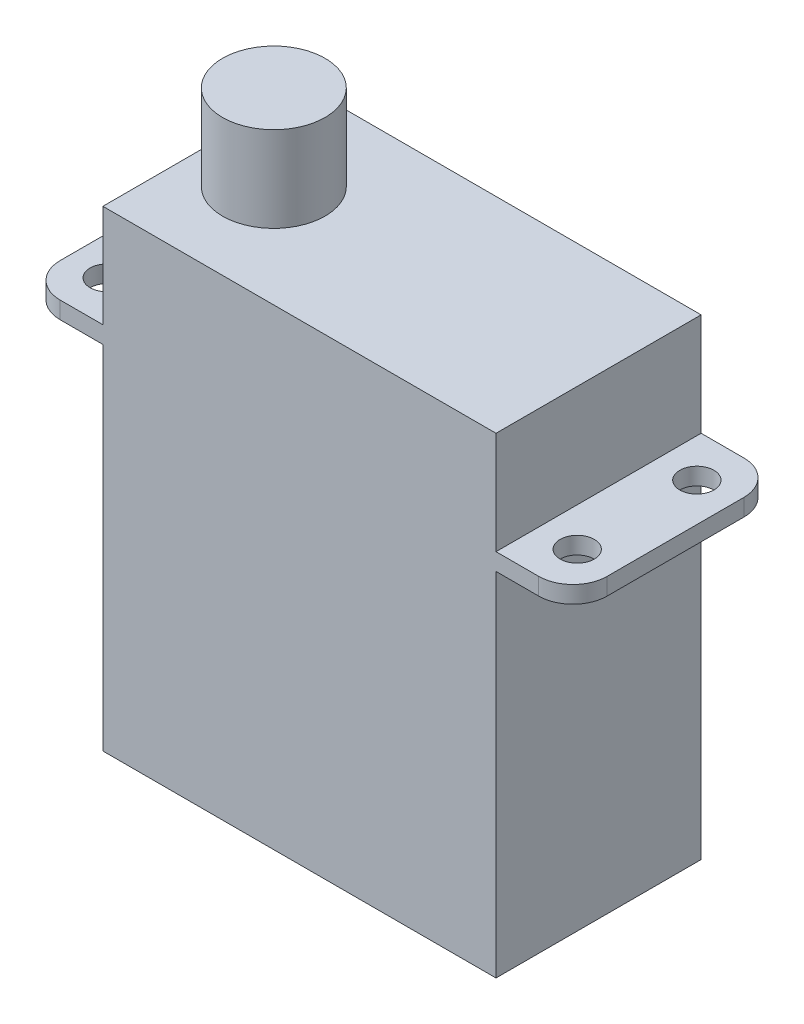
ISO-10303-21;
HEADER;
FILE_DESCRIPTION(('STEP AP214'),'2;1');
FILE_NAME('part.step','',(''),(''),'','','');
FILE_SCHEMA(('AUTOMOTIVE_DESIGN { 1 0 10303 214 1 1 1 1 }'));
ENDSEC;
DATA;
#1=APPLICATION_CONTEXT('core data for automotive mechanical design processes');
#2=APPLICATION_PROTOCOL_DEFINITION('international standard','automotive_design',2000,#1);
#3=PRODUCT_CONTEXT('',#1,'mechanical');
#4=PRODUCT('Part','Part','',(#3));
#5=PRODUCT_RELATED_PRODUCT_CATEGORY('part','',(#4));
#6=PRODUCT_DEFINITION_FORMATION('','',#4);
#7=PRODUCT_DEFINITION_CONTEXT('part definition',#1,'design');
#8=PRODUCT_DEFINITION('design','',#6,#7);
#9=PRODUCT_DEFINITION_SHAPE('','',#8);
#10=(LENGTH_UNIT() NAMED_UNIT(*) SI_UNIT(.MILLI.,.METRE.));
#11=(NAMED_UNIT(*) PLANE_ANGLE_UNIT() SI_UNIT($,.RADIAN.));
#12=(NAMED_UNIT(*) SI_UNIT($,.STERADIAN.) SOLID_ANGLE_UNIT());
#13=UNCERTAINTY_MEASURE_WITH_UNIT(LENGTH_MEASURE(1.E-05),#10,'distance_accuracy_value','');
#14=(GEOMETRIC_REPRESENTATION_CONTEXT(3) GLOBAL_UNCERTAINTY_ASSIGNED_CONTEXT((#13)) GLOBAL_UNIT_ASSIGNED_CONTEXT((#10,
#11,#12)) REPRESENTATION_CONTEXT('',''));
#15=CARTESIAN_POINT('',(0.,0.,0.));
#16=DIRECTION('',(0.,0.,1.));
#17=DIRECTION('',(1.,0.,0.));
#18=AXIS2_PLACEMENT_3D('',#15,#16,#17);
#19=CARTESIAN_POINT('',(0.,-13.8,6.));
#20=DIRECTION('',(0.,1.,0.));
#21=DIRECTION('',(0.,0.,1.));
#22=AXIS2_PLACEMENT_3D('',#19,#20,#21);
#23=PLANE('',#22);
#24=DIRECTION('',(1.,0.,0.));
#25=VECTOR('',#24,1.);
#26=CARTESIAN_POINT('',(0.,-13.8,-6.));
#27=LINE('',#26,#25);
#28=CARTESIAN_POINT('',(-11.5,-13.8,-6.));
#29=VERTEX_POINT('',#28);
#30=CARTESIAN_POINT('',(11.5,-13.8,-6.));
#31=VERTEX_POINT('',#30);
#32=EDGE_CURVE('E182',#29,#31,#27,.T.);
#33=ORIENTED_EDGE('',*,*,#32,.T.);
#34=DIRECTION('',(0.,0.,-1.));
#35=VECTOR('',#34,1.);
#36=CARTESIAN_POINT('',(11.5,-13.8,6.));
#37=LINE('',#36,#35);
#38=CARTESIAN_POINT('',(11.5,-13.8,6.));
#39=VERTEX_POINT('',#38);
#40=EDGE_CURVE('E162',#39,#31,#37,.T.);
#41=ORIENTED_EDGE('',*,*,#40,.F.);
#42=DIRECTION('',(1.,0.,0.));
#43=VECTOR('',#42,1.);
#44=CARTESIAN_POINT('',(0.,-13.8,6.));
#45=LINE('',#44,#43);
#46=CARTESIAN_POINT('',(-11.5,-13.8,6.));
#47=VERTEX_POINT('',#46);
#48=EDGE_CURVE('E169',#47,#39,#45,.T.);
#49=ORIENTED_EDGE('',*,*,#48,.F.);
#50=DIRECTION('',(0.,0.,-1.));
#51=VECTOR('',#50,1.);
#52=CARTESIAN_POINT('',(-11.5,-13.8,6.));
#53=LINE('',#52,#51);
#54=EDGE_CURVE('E349',#47,#29,#53,.T.);
#55=ORIENTED_EDGE('',*,*,#54,.T.);
#56=EDGE_LOOP('',(#33,#41,#49,#55));
#57=FACE_BOUND('',#56,.T.);
#58=ADVANCED_FACE('F41',(#57),#23,.F.);
#59=CARTESIAN_POINT('',(11.5,0.,6.));
#60=DIRECTION('',(-1.,0.,0.));
#61=DIRECTION('',(0.,0.,1.));
#62=AXIS2_PLACEMENT_3D('',#59,#60,#61);
#63=PLANE('',#62);
#64=DIRECTION('',(0.,1.,0.));
#65=VECTOR('',#64,1.);
#66=CARTESIAN_POINT('',(11.5,0.,-6.));
#67=LINE('',#66,#65);
#68=CARTESIAN_POINT('',(11.5,6.8,-6.));
#69=VERTEX_POINT('',#68);
#70=EDGE_CURVE('E334',#31,#69,#67,.T.);
#71=ORIENTED_EDGE('',*,*,#70,.T.);
#72=DIRECTION('',(0.,0.,-1.));
#73=VECTOR('',#72,1.);
#74=CARTESIAN_POINT('',(11.5,6.8,6.));
#75=LINE('',#74,#73);
#76=CARTESIAN_POINT('',(11.5,6.8,6.));
#77=VERTEX_POINT('',#76);
#78=EDGE_CURVE('E165',#77,#69,#75,.T.);
#79=ORIENTED_EDGE('',*,*,#78,.F.);
#80=DIRECTION('',(0.,1.,0.));
#81=VECTOR('',#80,1.);
#82=CARTESIAN_POINT('',(11.5,0.,6.));
#83=LINE('',#82,#81);
#84=EDGE_CURVE('E157',#39,#77,#83,.T.);
#85=ORIENTED_EDGE('',*,*,#84,.F.);
#86=ORIENTED_EDGE('',*,*,#40,.T.);
#87=EDGE_LOOP('',(#71,#79,#85,#86));
#88=FACE_BOUND('',#87,.T.);
#89=ADVANCED_FACE('F160',(#88),#63,.F.);
#90=CARTESIAN_POINT('',(0.,6.79999999999999,6.));
#91=DIRECTION('',(0.,-1.,0.));
#92=DIRECTION('',(1.,0.,0.));
#93=AXIS2_PLACEMENT_3D('',#90,#91,#92);
#94=PLANE('',#93);
#95=CARTESIAN_POINT('',(13.75,6.8,-3.5));
#96=DIRECTION('',(0.,-1.,0.));
#97=DIRECTION('',(1.,0.,0.));
#98=AXIS2_PLACEMENT_3D('',#95,#96,#97);
#99=CIRCLE('',#98,1.);
#100=CARTESIAN_POINT('',(12.75,6.8,-3.5));
#101=VERTEX_POINT('',#100);
#102=EDGE_CURVE('E212',#101,#101,#99,.T.);
#103=ORIENTED_EDGE('',*,*,#102,.F.);
#104=EDGE_LOOP('',(#103));
#105=FACE_BOUND('',#104,.T.);
#106=CARTESIAN_POINT('',(13.75,6.8,3.5));
#107=DIRECTION('',(0.,-1.,0.));
#108=DIRECTION('',(1.,0.,0.));
#109=AXIS2_PLACEMENT_3D('',#106,#107,#108);
#110=CIRCLE('',#109,1.);
#111=CARTESIAN_POINT('',(12.75,6.8,3.5));
#112=VERTEX_POINT('',#111);
#113=EDGE_CURVE('E208',#112,#112,#110,.T.);
#114=ORIENTED_EDGE('',*,*,#113,.F.);
#115=EDGE_LOOP('',(#114));
#116=FACE_BOUND('',#115,.T.);
#117=DIRECTION('',(-1.,0.,0.));
#118=VECTOR('',#117,1.);
#119=CARTESIAN_POINT('',(0.,6.79999999999999,-6.));
#120=LINE('',#119,#118);
#121=CARTESIAN_POINT('',(14.,6.8,-6.));
#122=VERTEX_POINT('',#121);
#123=EDGE_CURVE('E328',#122,#69,#120,.T.);
#124=ORIENTED_EDGE('',*,*,#123,.F.);
#125=CARTESIAN_POINT('',(14.,6.8,-4.));
#126=DIRECTION('',(0.,-1.,0.));
#127=DIRECTION('',(1.,0.,0.));
#128=AXIS2_PLACEMENT_3D('',#125,#126,#127);
#129=CIRCLE('',#128,2.);
#130=CARTESIAN_POINT('',(16.,6.8,-4.));
#131=VERTEX_POINT('',#130);
#132=EDGE_CURVE('E250',#122,#131,#129,.T.);
#133=ORIENTED_EDGE('',*,*,#132,.T.);
#134=DIRECTION('',(0.,0.,-1.));
#135=VECTOR('',#134,1.);
#136=CARTESIAN_POINT('',(16.,6.8,6.));
#137=LINE('',#136,#135);
#138=CARTESIAN_POINT('',(16.,6.8,4.));
#139=VERTEX_POINT('',#138);
#140=EDGE_CURVE('E190',#139,#131,#137,.T.);
#141=ORIENTED_EDGE('',*,*,#140,.F.);
#142=CARTESIAN_POINT('',(14.,6.8,4.));
#143=DIRECTION('',(0.,-1.,0.));
#144=DIRECTION('',(1.,0.,0.));
#145=AXIS2_PLACEMENT_3D('',#142,#143,#144);
#146=CIRCLE('',#145,2.);
#147=CARTESIAN_POINT('',(14.,6.8,6.));
#148=VERTEX_POINT('',#147);
#149=EDGE_CURVE('E57',#139,#148,#146,.T.);
#150=ORIENTED_EDGE('',*,*,#149,.T.);
#151=DIRECTION('',(-1.,0.,0.));
#152=VECTOR('',#151,1.);
#153=CARTESIAN_POINT('',(0.,6.79999999999999,6.));
#154=LINE('',#153,#152);
#155=EDGE_CURVE('E168',#148,#77,#154,.T.);
#156=ORIENTED_EDGE('',*,*,#155,.T.);
#157=ORIENTED_EDGE('',*,*,#78,.T.);
#158=EDGE_LOOP('',(#124,#133,#141,#150,#156,#157));
#159=FACE_BOUND('',#158,.T.);
#160=ADVANCED_FACE('F379',(#105,#116,#159),#94,.T.);
#161=CARTESIAN_POINT('',(16.,0.,6.));
#162=DIRECTION('',(-1.,0.,0.));
#163=DIRECTION('',(0.,0.,1.));
#164=AXIS2_PLACEMENT_3D('',#161,#162,#163);
#165=PLANE('',#164);
#166=ORIENTED_EDGE('',*,*,#140,.T.);
#167=DIRECTION('',(0.,1.,0.));
#168=VECTOR('',#167,1.);
#169=CARTESIAN_POINT('',(16.,0.,-4.));
#170=LINE('',#169,#168);
#171=CARTESIAN_POINT('',(16.,7.8,-4.));
#172=VERTEX_POINT('',#171);
#173=EDGE_CURVE('E239',#131,#172,#170,.T.);
#174=ORIENTED_EDGE('',*,*,#173,.T.);
#175=DIRECTION('',(0.,0.,-1.));
#176=VECTOR('',#175,1.);
#177=CARTESIAN_POINT('',(16.,7.8,6.));
#178=LINE('',#177,#176);
#179=CARTESIAN_POINT('',(16.,7.8,4.));
#180=VERTEX_POINT('',#179);
#181=EDGE_CURVE('E301',#180,#172,#178,.T.);
#182=ORIENTED_EDGE('',*,*,#181,.F.);
#183=DIRECTION('',(0.,1.,0.));
#184=VECTOR('',#183,1.);
#185=CARTESIAN_POINT('',(16.,6.8,4.));
#186=LINE('',#185,#184);
#187=EDGE_CURVE('E236',#180,#139,#186,.F.);
#188=ORIENTED_EDGE('',*,*,#187,.T.);
#189=EDGE_LOOP('',(#166,#174,#182,#188));
#190=FACE_BOUND('',#189,.T.);
#191=ADVANCED_FACE('F308',(#190),#165,.F.);
#192=CARTESIAN_POINT('',(0.,7.79999999999999,6.));
#193=DIRECTION('',(0.,-1.,0.));
#194=DIRECTION('',(1.,0.,0.));
#195=AXIS2_PLACEMENT_3D('',#192,#193,#194);
#196=PLANE('',#195);
#197=CARTESIAN_POINT('',(13.75,7.8,-3.5));
#198=DIRECTION('',(0.,-1.,0.));
#199=DIRECTION('',(1.,0.,0.));
#200=AXIS2_PLACEMENT_3D('',#197,#198,#199);
#201=CIRCLE('',#200,1.);
#202=CARTESIAN_POINT('',(12.75,7.8,-3.5));
#203=VERTEX_POINT('',#202);
#204=EDGE_CURVE('E209',#203,#203,#201,.T.);
#205=ORIENTED_EDGE('',*,*,#204,.T.);
#206=EDGE_LOOP('',(#205));
#207=FACE_BOUND('',#206,.T.);
#208=CARTESIAN_POINT('',(13.75,7.8,3.5));
#209=DIRECTION('',(0.,-1.,0.));
#210=DIRECTION('',(1.,0.,0.));
#211=AXIS2_PLACEMENT_3D('',#208,#209,#210);
#212=CIRCLE('',#211,1.);
#213=CARTESIAN_POINT('',(12.75,7.8,3.5));
#214=VERTEX_POINT('',#213);
#215=EDGE_CURVE('E204',#214,#214,#212,.T.);
#216=ORIENTED_EDGE('',*,*,#215,.T.);
#217=EDGE_LOOP('',(#216));
#218=FACE_BOUND('',#217,.T.);
#219=ORIENTED_EDGE('',*,*,#181,.T.);
#220=CARTESIAN_POINT('',(14.,7.8,-4.));
#221=DIRECTION('',(0.,-1.,0.));
#222=DIRECTION('',(1.,0.,0.));
#223=AXIS2_PLACEMENT_3D('',#220,#221,#222);
#224=CIRCLE('',#223,2.);
#225=CARTESIAN_POINT('',(14.,7.8,-6.));
#226=VERTEX_POINT('',#225);
#227=EDGE_CURVE('E245',#172,#226,#224,.F.);
#228=ORIENTED_EDGE('',*,*,#227,.T.);
#229=DIRECTION('',(-1.,0.,0.));
#230=VECTOR('',#229,1.);
#231=CARTESIAN_POINT('',(0.,7.79999999999999,-6.));
#232=LINE('',#231,#230);
#233=CARTESIAN_POINT('',(11.5,7.8,-6.));
#234=VERTEX_POINT('',#233);
#235=EDGE_CURVE('E318',#226,#234,#232,.T.);
#236=ORIENTED_EDGE('',*,*,#235,.T.);
#237=DIRECTION('',(0.,0.,-1.));
#238=VECTOR('',#237,1.);
#239=CARTESIAN_POINT('',(11.5,7.8,6.));
#240=LINE('',#239,#238);
#241=CARTESIAN_POINT('',(11.5,7.8,6.));
#242=VERTEX_POINT('',#241);
#243=EDGE_CURVE('E297',#242,#234,#240,.T.);
#244=ORIENTED_EDGE('',*,*,#243,.F.);
#245=DIRECTION('',(-1.,0.,0.));
#246=VECTOR('',#245,1.);
#247=CARTESIAN_POINT('',(0.,7.79999999999999,6.));
#248=LINE('',#247,#246);
#249=CARTESIAN_POINT('',(14.,7.8,6.));
#250=VERTEX_POINT('',#249);
#251=EDGE_CURVE('E360',#250,#242,#248,.T.);
#252=ORIENTED_EDGE('',*,*,#251,.F.);
#253=CARTESIAN_POINT('',(14.,7.8,4.));
#254=DIRECTION('',(0.,-1.,0.));
#255=DIRECTION('',(1.,0.,0.));
#256=AXIS2_PLACEMENT_3D('',#253,#254,#255);
#257=CIRCLE('',#256,2.);
#258=EDGE_CURVE('E65',#250,#180,#257,.F.);
#259=ORIENTED_EDGE('',*,*,#258,.T.);
#260=EDGE_LOOP('',(#219,#228,#236,#244,#252,#259));
#261=FACE_BOUND('',#260,.T.);
#262=ADVANCED_FACE('F316',(#207,#218,#261),#196,.F.);
#263=CARTESIAN_POINT('',(11.5,13.8,-6.));
#264=VERTEX_POINT('',#263);
#265=EDGE_CURVE('E326',#234,#264,#67,.T.);
#266=ORIENTED_EDGE('',*,*,#265,.T.);
#267=DIRECTION('',(0.,0.,-1.));
#268=VECTOR('',#267,1.);
#269=CARTESIAN_POINT('',(11.5,13.8,6.));
#270=LINE('',#269,#268);
#271=CARTESIAN_POINT('',(11.5,13.8,6.));
#272=VERTEX_POINT('',#271);
#273=EDGE_CURVE('E294',#272,#264,#270,.T.);
#274=ORIENTED_EDGE('',*,*,#273,.F.);
#275=EDGE_CURVE('E171',#242,#272,#83,.T.);
#276=ORIENTED_EDGE('',*,*,#275,.F.);
#277=ORIENTED_EDGE('',*,*,#243,.T.);
#278=EDGE_LOOP('',(#266,#274,#276,#277));
#279=FACE_BOUND('',#278,.T.);
#280=ADVANCED_FACE('F395',(#279),#63,.F.);
#281=CARTESIAN_POINT('',(0.,13.8,6.));
#282=DIRECTION('',(0.,1.,0.));
#283=DIRECTION('',(0.,0.,1.));
#284=AXIS2_PLACEMENT_3D('',#281,#282,#283);
#285=PLANE('',#284);
#286=CARTESIAN_POINT('',(-7.5,13.8,0.));
#287=DIRECTION('',(0.,1.,0.));
#288=DIRECTION('',(0.,0.,1.));
#289=AXIS2_PLACEMENT_3D('',#286,#287,#288);
#290=CIRCLE('',#289,3.);
#291=CARTESIAN_POINT('',(-7.5,13.8,3.));
#292=VERTEX_POINT('',#291);
#293=EDGE_CURVE('E450',#292,#292,#290,.T.);
#294=ORIENTED_EDGE('',*,*,#293,.F.);
#295=EDGE_LOOP('',(#294));
#296=FACE_BOUND('',#295,.T.);
#297=DIRECTION('',(1.,0.,0.));
#298=VECTOR('',#297,1.);
#299=CARTESIAN_POINT('',(0.,13.8,-6.));
#300=LINE('',#299,#298);
#301=CARTESIAN_POINT('',(-11.5,13.8,-6.));
#302=VERTEX_POINT('',#301);
#303=EDGE_CURVE('E332',#302,#264,#300,.T.);
#304=ORIENTED_EDGE('',*,*,#303,.F.);
#305=DIRECTION('',(0.,0.,-1.));
#306=VECTOR('',#305,1.);
#307=CARTESIAN_POINT('',(-11.5,13.8,6.));
#308=LINE('',#307,#306);
#309=CARTESIAN_POINT('',(-11.5,13.8,6.));
#310=VERTEX_POINT('',#309);
#311=EDGE_CURVE('E287',#310,#302,#308,.T.);
#312=ORIENTED_EDGE('',*,*,#311,.F.);
#313=DIRECTION('',(1.,0.,0.));
#314=VECTOR('',#313,1.);
#315=CARTESIAN_POINT('',(0.,13.8,6.));
#316=LINE('',#315,#314);
#317=EDGE_CURVE('E365',#310,#272,#316,.T.);
#318=ORIENTED_EDGE('',*,*,#317,.T.);
#319=ORIENTED_EDGE('',*,*,#273,.T.);
#320=EDGE_LOOP('',(#304,#312,#318,#319));
#321=FACE_BOUND('',#320,.T.);
#322=ADVANCED_FACE('F415',(#296,#321),#285,.T.);
#323=CARTESIAN_POINT('',(-11.5,0.,6.));
#324=DIRECTION('',(-1.,0.,0.));
#325=DIRECTION('',(0.,0.,1.));
#326=AXIS2_PLACEMENT_3D('',#323,#324,#325);
#327=PLANE('',#326);
#328=DIRECTION('',(0.,1.,0.));
#329=VECTOR('',#328,1.);
#330=CARTESIAN_POINT('',(-11.5,0.,-6.));
#331=LINE('',#330,#329);
#332=CARTESIAN_POINT('',(-11.5,7.8,-6.));
#333=VERTEX_POINT('',#332);
#334=EDGE_CURVE('E339',#333,#302,#331,.T.);
#335=ORIENTED_EDGE('',*,*,#334,.F.);
#336=DIRECTION('',(0.,0.,-1.));
#337=VECTOR('',#336,1.);
#338=CARTESIAN_POINT('',(-11.5,7.8,6.));
#339=LINE('',#338,#337);
#340=CARTESIAN_POINT('',(-11.5,7.8,6.));
#341=VERTEX_POINT('',#340);
#342=EDGE_CURVE('E282',#341,#333,#339,.T.);
#343=ORIENTED_EDGE('',*,*,#342,.F.);
#344=DIRECTION('',(0.,1.,0.));
#345=VECTOR('',#344,1.);
#346=CARTESIAN_POINT('',(-11.5,0.,6.));
#347=LINE('',#346,#345);
#348=EDGE_CURVE('E368',#341,#310,#347,.T.);
#349=ORIENTED_EDGE('',*,*,#348,.T.);
#350=ORIENTED_EDGE('',*,*,#311,.T.);
#351=EDGE_LOOP('',(#335,#343,#349,#350));
#352=FACE_BOUND('',#351,.T.);
#353=ADVANCED_FACE('F412',(#352),#327,.T.);
#354=CARTESIAN_POINT('',(0.,7.8,6.));
#355=DIRECTION('',(0.,1.,0.));
#356=DIRECTION('',(0.,0.,1.));
#357=AXIS2_PLACEMENT_3D('',#354,#355,#356);
#358=PLANE('',#357);
#359=CARTESIAN_POINT('',(-13.75,7.8,3.5));
#360=DIRECTION('',(0.,1.,0.));
#361=DIRECTION('',(0.,0.,1.));
#362=AXIS2_PLACEMENT_3D('',#359,#360,#361);
#363=CIRCLE('',#362,1.);
#364=CARTESIAN_POINT('',(-14.75,7.8,3.5));
#365=VERTEX_POINT('',#364);
#366=EDGE_CURVE('E203',#365,#365,#363,.T.);
#367=ORIENTED_EDGE('',*,*,#366,.F.);
#368=EDGE_LOOP('',(#367));
#369=FACE_BOUND('',#368,.T.);
#370=CARTESIAN_POINT('',(-13.75,7.8,-3.5));
#371=DIRECTION('',(0.,1.,0.));
#372=DIRECTION('',(0.,0.,1.));
#373=AXIS2_PLACEMENT_3D('',#370,#371,#372);
#374=CIRCLE('',#373,1.);
#375=CARTESIAN_POINT('',(-14.75,7.8,-3.5));
#376=VERTEX_POINT('',#375);
#377=EDGE_CURVE('E198',#376,#376,#374,.T.);
#378=ORIENTED_EDGE('',*,*,#377,.F.);
#379=EDGE_LOOP('',(#378));
#380=FACE_BOUND('',#379,.T.);
#381=DIRECTION('',(1.,0.,0.));
#382=VECTOR('',#381,1.);
#383=CARTESIAN_POINT('',(0.,7.8,-6.));
#384=LINE('',#383,#382);
#385=CARTESIAN_POINT('',(-14.,7.8,-6.));
#386=VERTEX_POINT('',#385);
#387=EDGE_CURVE('E343',#386,#333,#384,.T.);
#388=ORIENTED_EDGE('',*,*,#387,.F.);
#389=CARTESIAN_POINT('',(-14.,7.8,-4.));
#390=DIRECTION('',(0.,1.,0.));
#391=DIRECTION('',(0.,0.,1.));
#392=AXIS2_PLACEMENT_3D('',#389,#390,#391);
#393=CIRCLE('',#392,2.);
#394=CARTESIAN_POINT('',(-16.,7.8,-4.));
#395=VERTEX_POINT('',#394);
#396=EDGE_CURVE('E220',#386,#395,#393,.T.);
#397=ORIENTED_EDGE('',*,*,#396,.T.);
#398=DIRECTION('',(0.,0.,-1.));
#399=VECTOR('',#398,1.);
#400=CARTESIAN_POINT('',(-16.,7.8,6.));
#401=LINE('',#400,#399);
#402=CARTESIAN_POINT('',(-16.,7.8,4.));
#403=VERTEX_POINT('',#402);
#404=EDGE_CURVE('E275',#403,#395,#401,.T.);
#405=ORIENTED_EDGE('',*,*,#404,.F.);
#406=CARTESIAN_POINT('',(-14.,7.8,4.));
#407=DIRECTION('',(0.,1.,0.));
#408=DIRECTION('',(0.,0.,1.));
#409=AXIS2_PLACEMENT_3D('',#406,#407,#408);
#410=CIRCLE('',#409,2.);
#411=CARTESIAN_POINT('',(-14.,7.8,6.));
#412=VERTEX_POINT('',#411);
#413=EDGE_CURVE('E217',#403,#412,#410,.T.);
#414=ORIENTED_EDGE('',*,*,#413,.T.);
#415=DIRECTION('',(1.,0.,0.));
#416=VECTOR('',#415,1.);
#417=CARTESIAN_POINT('',(0.,7.8,6.));
#418=LINE('',#417,#416);
#419=EDGE_CURVE('E259',#412,#341,#418,.T.);
#420=ORIENTED_EDGE('',*,*,#419,.T.);
#421=ORIENTED_EDGE('',*,*,#342,.T.);
#422=EDGE_LOOP('',(#388,#397,#405,#414,#420,#421));
#423=FACE_BOUND('',#422,.T.);
#424=ADVANCED_FACE('F280',(#369,#380,#423),#358,.T.);
#425=CARTESIAN_POINT('',(-16.,0.,6.));
#426=DIRECTION('',(-1.,0.,0.));
#427=DIRECTION('',(0.,0.,1.));
#428=AXIS2_PLACEMENT_3D('',#425,#426,#427);
#429=PLANE('',#428);
#430=ORIENTED_EDGE('',*,*,#404,.T.);
#431=DIRECTION('',(0.,1.,0.));
#432=VECTOR('',#431,1.);
#433=CARTESIAN_POINT('',(-16.,6.8,-4.));
#434=LINE('',#433,#432);
#435=CARTESIAN_POINT('',(-16.,6.8,-4.));
#436=VERTEX_POINT('',#435);
#437=EDGE_CURVE('E227',#395,#436,#434,.F.);
#438=ORIENTED_EDGE('',*,*,#437,.T.);
#439=DIRECTION('',(0.,0.,-1.));
#440=VECTOR('',#439,1.);
#441=CARTESIAN_POINT('',(-16.,6.8,6.));
#442=LINE('',#441,#440);
#443=CARTESIAN_POINT('',(-16.,6.8,4.));
#444=VERTEX_POINT('',#443);
#445=EDGE_CURVE('E277',#444,#436,#442,.T.);
#446=ORIENTED_EDGE('',*,*,#445,.F.);
#447=DIRECTION('',(0.,1.,0.));
#448=VECTOR('',#447,1.);
#449=CARTESIAN_POINT('',(-16.,0.,4.));
#450=LINE('',#449,#448);
#451=EDGE_CURVE('E223',#444,#403,#450,.T.);
#452=ORIENTED_EDGE('',*,*,#451,.T.);
#453=EDGE_LOOP('',(#430,#438,#446,#452));
#454=FACE_BOUND('',#453,.T.);
#455=ADVANCED_FACE('F274',(#454),#429,.T.);
#456=CARTESIAN_POINT('',(0.,6.8,6.));
#457=DIRECTION('',(0.,1.,0.));
#458=DIRECTION('',(0.,0.,1.));
#459=AXIS2_PLACEMENT_3D('',#456,#457,#458);
#460=PLANE('',#459);
#461=CARTESIAN_POINT('',(-13.75,6.8,3.5));
#462=DIRECTION('',(0.,1.,0.));
#463=DIRECTION('',(0.,0.,1.));
#464=AXIS2_PLACEMENT_3D('',#461,#462,#463);
#465=CIRCLE('',#464,1.);
#466=CARTESIAN_POINT('',(-14.75,6.8,3.5));
#467=VERTEX_POINT('',#466);
#468=EDGE_CURVE('E199',#467,#467,#465,.T.);
#469=ORIENTED_EDGE('',*,*,#468,.T.);
#470=EDGE_LOOP('',(#469));
#471=FACE_BOUND('',#470,.T.);
#472=CARTESIAN_POINT('',(-13.75,6.8,-3.5));
#473=DIRECTION('',(0.,1.,0.));
#474=DIRECTION('',(0.,0.,1.));
#475=AXIS2_PLACEMENT_3D('',#472,#473,#474);
#476=CIRCLE('',#475,1.);
#477=CARTESIAN_POINT('',(-14.75,6.8,-3.5));
#478=VERTEX_POINT('',#477);
#479=EDGE_CURVE('E194',#478,#478,#476,.T.);
#480=ORIENTED_EDGE('',*,*,#479,.T.);
#481=EDGE_LOOP('',(#480));
#482=FACE_BOUND('',#481,.T.);
#483=ORIENTED_EDGE('',*,*,#445,.T.);
#484=CARTESIAN_POINT('',(-14.,6.8,-4.));
#485=DIRECTION('',(0.,1.,0.));
#486=DIRECTION('',(0.,0.,1.));
#487=AXIS2_PLACEMENT_3D('',#484,#485,#486);
#488=CIRCLE('',#487,2.);
#489=CARTESIAN_POINT('',(-14.,6.8,-6.));
#490=VERTEX_POINT('',#489);
#491=EDGE_CURVE('E233',#436,#490,#488,.F.);
#492=ORIENTED_EDGE('',*,*,#491,.T.);
#493=DIRECTION('',(1.,0.,0.));
#494=VECTOR('',#493,1.);
#495=CARTESIAN_POINT('',(0.,6.8,-6.));
#496=LINE('',#495,#494);
#497=CARTESIAN_POINT('',(-11.5,6.8,-6.));
#498=VERTEX_POINT('',#497);
#499=EDGE_CURVE('E346',#490,#498,#496,.T.);
#500=ORIENTED_EDGE('',*,*,#499,.T.);
#501=DIRECTION('',(0.,0.,-1.));
#502=VECTOR('',#501,1.);
#503=CARTESIAN_POINT('',(-11.5,6.8,6.));
#504=LINE('',#503,#502);
#505=CARTESIAN_POINT('',(-11.5,6.8,6.));
#506=VERTEX_POINT('',#505);
#507=EDGE_CURVE('E267',#506,#498,#504,.T.);
#508=ORIENTED_EDGE('',*,*,#507,.F.);
#509=DIRECTION('',(1.,0.,0.));
#510=VECTOR('',#509,1.);
#511=CARTESIAN_POINT('',(0.,6.8,6.));
#512=LINE('',#511,#510);
#513=CARTESIAN_POINT('',(-14.,6.8,6.));
#514=VERTEX_POINT('',#513);
#515=EDGE_CURVE('E256',#514,#506,#512,.T.);
#516=ORIENTED_EDGE('',*,*,#515,.F.);
#517=CARTESIAN_POINT('',(-14.,6.8,4.));
#518=DIRECTION('',(0.,1.,0.));
#519=DIRECTION('',(0.,0.,1.));
#520=AXIS2_PLACEMENT_3D('',#517,#518,#519);
#521=CIRCLE('',#520,2.);
#522=EDGE_CURVE('E230',#514,#444,#521,.F.);
#523=ORIENTED_EDGE('',*,*,#522,.T.);
#524=EDGE_LOOP('',(#483,#492,#500,#508,#516,#523));
#525=FACE_BOUND('',#524,.T.);
#526=ADVANCED_FACE('F264',(#471,#482,#525),#460,.F.);
#527=EDGE_CURVE('E179',#29,#498,#331,.T.);
#528=ORIENTED_EDGE('',*,*,#527,.F.);
#529=ORIENTED_EDGE('',*,*,#54,.F.);
#530=EDGE_CURVE('E176',#47,#506,#347,.T.);
#531=ORIENTED_EDGE('',*,*,#530,.T.);
#532=ORIENTED_EDGE('',*,*,#507,.T.);
#533=EDGE_LOOP('',(#528,#529,#531,#532));
#534=FACE_BOUND('',#533,.T.);
#535=ADVANCED_FACE('F355',(#534),#327,.T.);
#536=CARTESIAN_POINT('',(0.,0.,6.));
#537=DIRECTION('',(0.,0.,1.));
#538=DIRECTION('',(1.,0.,0.));
#539=AXIS2_PLACEMENT_3D('',#536,#537,#538);
#540=PLANE('',#539);
#541=ORIENTED_EDGE('',*,*,#155,.F.);
#542=DIRECTION('',(0.,1.,0.));
#543=VECTOR('',#542,1.);
#544=CARTESIAN_POINT('',(14.,7.8,6.));
#545=LINE('',#544,#543);
#546=EDGE_CURVE('E11',#148,#250,#545,.T.);
#547=ORIENTED_EDGE('',*,*,#546,.T.);
#548=ORIENTED_EDGE('',*,*,#251,.T.);
#549=ORIENTED_EDGE('',*,*,#275,.T.);
#550=ORIENTED_EDGE('',*,*,#317,.F.);
#551=ORIENTED_EDGE('',*,*,#348,.F.);
#552=ORIENTED_EDGE('',*,*,#419,.F.);
#553=DIRECTION('',(0.,1.,0.));
#554=VECTOR('',#553,1.);
#555=CARTESIAN_POINT('',(-14.,0.,6.));
#556=LINE('',#555,#554);
#557=EDGE_CURVE('E50',#412,#514,#556,.F.);
#558=ORIENTED_EDGE('',*,*,#557,.T.);
#559=ORIENTED_EDGE('',*,*,#515,.T.);
#560=ORIENTED_EDGE('',*,*,#530,.F.);
#561=ORIENTED_EDGE('',*,*,#48,.T.);
#562=ORIENTED_EDGE('',*,*,#84,.T.);
#563=EDGE_LOOP('',(#541,#547,#548,#549,#550,#551,#552,#558,#559,#560,#561,#562));
#564=FACE_BOUND('',#563,.T.);
#565=ADVANCED_FACE('F174',(#564),#540,.T.);
#566=CARTESIAN_POINT('',(0.,0.,-6.));
#567=DIRECTION('',(0.,0.,1.));
#568=DIRECTION('',(1.,0.,0.));
#569=AXIS2_PLACEMENT_3D('',#566,#567,#568);
#570=PLANE('',#569);
#571=ORIENTED_EDGE('',*,*,#499,.F.);
#572=DIRECTION('',(0.,1.,0.));
#573=VECTOR('',#572,1.);
#574=CARTESIAN_POINT('',(-14.,7.8,-6.));
#575=LINE('',#574,#573);
#576=EDGE_CURVE('E188',#490,#386,#575,.T.);
#577=ORIENTED_EDGE('',*,*,#576,.T.);
#578=ORIENTED_EDGE('',*,*,#387,.T.);
#579=ORIENTED_EDGE('',*,*,#334,.T.);
#580=ORIENTED_EDGE('',*,*,#303,.T.);
#581=ORIENTED_EDGE('',*,*,#265,.F.);
#582=ORIENTED_EDGE('',*,*,#235,.F.);
#583=DIRECTION('',(0.,1.,0.));
#584=VECTOR('',#583,1.);
#585=CARTESIAN_POINT('',(14.,0.,-6.));
#586=LINE('',#585,#584);
#587=EDGE_CURVE('E184',#226,#122,#586,.F.);
#588=ORIENTED_EDGE('',*,*,#587,.T.);
#589=ORIENTED_EDGE('',*,*,#123,.T.);
#590=ORIENTED_EDGE('',*,*,#70,.F.);
#591=ORIENTED_EDGE('',*,*,#32,.F.);
#592=ORIENTED_EDGE('',*,*,#527,.T.);
#593=EDGE_LOOP('',(#571,#577,#578,#579,#580,#581,#582,#588,#589,#590,#591,#592));
#594=FACE_BOUND('',#593,.T.);
#595=ADVANCED_FACE('F322',(#594),#570,.F.);
#596=CARTESIAN_POINT('',(-7.5,18.8,0.));
#597=DIRECTION('',(0.,-1.,0.));
#598=DIRECTION('',(0.,0.,-1.));
#599=AXIS2_PLACEMENT_3D('',#596,#597,#598);
#600=CYLINDRICAL_SURFACE('',#599,3.);
#601=CARTESIAN_POINT('',(-7.5,18.8,0.));
#602=DIRECTION('',(0.,1.,0.));
#603=DIRECTION('',(0.,0.,1.));
#604=AXIS2_PLACEMENT_3D('',#601,#602,#603);
#605=CIRCLE('',#604,3.);
#606=CARTESIAN_POINT('',(-7.5,18.8,3.));
#607=VERTEX_POINT('',#606);
#608=EDGE_CURVE('E377',#607,#607,#605,.T.);
#609=ORIENTED_EDGE('',*,*,#608,.F.);
#610=EDGE_LOOP('',(#609));
#611=FACE_BOUND('',#610,.T.);
#612=ORIENTED_EDGE('',*,*,#293,.T.);
#613=EDGE_LOOP('',(#612));
#614=FACE_BOUND('',#613,.T.);
#615=ADVANCED_FACE('F458',(#611,#614),#600,.T.);
#616=CARTESIAN_POINT('',(-7.5,18.8,0.));
#617=DIRECTION('',(0.,1.,0.));
#618=DIRECTION('',(0.,0.,1.));
#619=AXIS2_PLACEMENT_3D('',#616,#617,#618);
#620=PLANE('',#619);
#621=ORIENTED_EDGE('',*,*,#608,.T.);
#622=EDGE_LOOP('',(#621));
#623=FACE_BOUND('',#622,.T.);
#624=ADVANCED_FACE('F460',(#623),#620,.T.);
#625=CARTESIAN_POINT('',(-13.75,-13.8,-3.5));
#626=DIRECTION('',(0.,1.,0.));
#627=DIRECTION('',(-1.,0.,0.));
#628=AXIS2_PLACEMENT_3D('',#625,#626,#627);
#629=CYLINDRICAL_SURFACE('',#628,1.);
#630=CARTESIAN_POINT('',(-14.75,7.8,-3.5));
#631=CARTESIAN_POINT('',(-14.75,7.78958333333333,-3.5));
#632=CARTESIAN_POINT('',(-14.75,7.77916666666667,-3.5));
#633=CARTESIAN_POINT('',(-14.75,7.75833333333333,-3.5));
#634=CARTESIAN_POINT('',(-14.75,7.74791666666667,-3.5));
#635=CARTESIAN_POINT('',(-14.75,7.72708333333333,-3.5));
#636=CARTESIAN_POINT('',(-14.75,7.71666666666667,-3.5));
#637=CARTESIAN_POINT('',(-14.75,7.69583333333333,-3.5));
#638=CARTESIAN_POINT('',(-14.75,7.68541666666667,-3.5));
#639=CARTESIAN_POINT('',(-14.75,7.66458333333333,-3.5));
#640=CARTESIAN_POINT('',(-14.75,7.65416666666667,-3.5));
#641=CARTESIAN_POINT('',(-14.75,7.63333333333333,-3.5));
#642=CARTESIAN_POINT('',(-14.75,7.62291666666667,-3.5));
#643=CARTESIAN_POINT('',(-14.75,7.60208333333333,-3.5));
#644=CARTESIAN_POINT('',(-14.75,7.59166666666667,-3.5));
#645=CARTESIAN_POINT('',(-14.75,7.57083333333333,-3.5));
#646=CARTESIAN_POINT('',(-14.75,7.56041666666667,-3.5));
#647=CARTESIAN_POINT('',(-14.75,7.53958333333333,-3.5));
#648=CARTESIAN_POINT('',(-14.75,7.52916666666667,-3.5));
#649=CARTESIAN_POINT('',(-14.75,7.50833333333333,-3.5));
#650=CARTESIAN_POINT('',(-14.75,7.49791666666667,-3.5));
#651=CARTESIAN_POINT('',(-14.75,7.47708333333333,-3.5));
#652=CARTESIAN_POINT('',(-14.75,7.46666666666667,-3.5));
#653=CARTESIAN_POINT('',(-14.75,7.44583333333333,-3.5));
#654=CARTESIAN_POINT('',(-14.75,7.43541666666667,-3.5));
#655=CARTESIAN_POINT('',(-14.75,7.41458333333333,-3.5));
#656=CARTESIAN_POINT('',(-14.75,7.40416666666667,-3.5));
#657=CARTESIAN_POINT('',(-14.75,7.38333333333333,-3.5));
#658=CARTESIAN_POINT('',(-14.75,7.37291666666667,-3.5));
#659=CARTESIAN_POINT('',(-14.75,7.35208333333333,-3.5));
#660=CARTESIAN_POINT('',(-14.75,7.34166666666667,-3.5));
#661=CARTESIAN_POINT('',(-14.75,7.32083333333333,-3.5));
#662=CARTESIAN_POINT('',(-14.75,7.31041666666667,-3.5));
#663=CARTESIAN_POINT('',(-14.75,7.28958333333333,-3.5));
#664=CARTESIAN_POINT('',(-14.75,7.27916666666667,-3.5));
#665=CARTESIAN_POINT('',(-14.75,7.25833333333333,-3.5));
#666=CARTESIAN_POINT('',(-14.75,7.24791666666667,-3.5));
#667=CARTESIAN_POINT('',(-14.75,7.22708333333333,-3.5));
#668=CARTESIAN_POINT('',(-14.75,7.21666666666667,-3.5));
#669=CARTESIAN_POINT('',(-14.75,7.19583333333333,-3.5));
#670=CARTESIAN_POINT('',(-14.75,7.18541666666667,-3.5));
#671=CARTESIAN_POINT('',(-14.75,7.16458333333333,-3.5));
#672=CARTESIAN_POINT('',(-14.75,7.15416666666667,-3.5));
#673=CARTESIAN_POINT('',(-14.75,7.13333333333333,-3.5));
#674=CARTESIAN_POINT('',(-14.75,7.12291666666667,-3.5));
#675=CARTESIAN_POINT('',(-14.75,7.10208333333333,-3.5));
#676=CARTESIAN_POINT('',(-14.75,7.09166666666667,-3.5));
#677=CARTESIAN_POINT('',(-14.75,7.07083333333333,-3.5));
#678=CARTESIAN_POINT('',(-14.75,7.06041666666667,-3.5));
#679=CARTESIAN_POINT('',(-14.75,7.03958333333333,-3.5));
#680=CARTESIAN_POINT('',(-14.75,7.02916666666667,-3.5));
#681=CARTESIAN_POINT('',(-14.75,7.00833333333333,-3.5));
#682=CARTESIAN_POINT('',(-14.75,6.99791666666667,-3.5));
#683=CARTESIAN_POINT('',(-14.75,6.97708333333333,-3.5));
#684=CARTESIAN_POINT('',(-14.75,6.96666666666667,-3.5));
#685=CARTESIAN_POINT('',(-14.75,6.94583333333333,-3.5));
#686=CARTESIAN_POINT('',(-14.75,6.93541666666667,-3.5));
#687=CARTESIAN_POINT('',(-14.75,6.91458333333333,-3.5));
#688=CARTESIAN_POINT('',(-14.75,6.90416666666667,-3.5));
#689=CARTESIAN_POINT('',(-14.75,6.88333333333333,-3.5));
#690=CARTESIAN_POINT('',(-14.75,6.87291666666667,-3.5));
#691=CARTESIAN_POINT('',(-14.75,6.85208333333333,-3.5));
#692=CARTESIAN_POINT('',(-14.75,6.84166666666667,-3.5));
#693=CARTESIAN_POINT('',(-14.75,6.82083333333333,-3.5));
#694=CARTESIAN_POINT('',(-14.75,6.81041666666667,-3.5));
#695=CARTESIAN_POINT('',(-14.75,6.8,-3.5));
#696=B_SPLINE_CURVE_WITH_KNOTS('',3,(#630,#631,#632,#633,#634,#635,#636,#637,#638,#639,#640,
#641,#642,#643,#644,#645,#646,#647,#648,#649,#650,#651,#652,#653,#654,#655,#656,#657,#658,#659,
#660,#661,#662,#663,#664,#665,#666,#667,#668,#669,#670,#671,#672,#673,#674,#675,#676,#677,#678,
#679,#680,#681,#682,#683,#684,#685,#686,#687,#688,#689,#690,#691,#692,#693,#694,#695),
.UNSPECIFIED.,.F.,.F.,(4,2,2,2,2,2,2,2,2,2,2,2,2,2,2,2,2,2,2,2,2,2,2,2,2,2,2,2,2,2,2,2,4),(0.,
0.03125,0.0625000000000001,0.0937500000000001,0.125,0.15625,0.1875,0.21875,0.25,0.28125,0.3125,
0.34375,0.375,0.40625,0.4375,0.46875,0.5,0.53125,0.5625,0.593750000000001,0.625000000000001,
0.656250000000001,0.687500000000001,0.718750000000001,0.750000000000001,0.781250000000001,
0.812500000000001,0.843750000000001,0.875000000000001,0.906250000000001,0.937500000000001,
0.968750000000001,1.),.UNSPECIFIED.);
#697=EDGE_CURVE('BSEAM467',#376,#478,#696,.T.);
#698=ORIENTED_EDGE('',*,*,#377,.T.);
#699=ORIENTED_EDGE('',*,*,#479,.F.);
#700=ORIENTED_EDGE('',*,*,#697,.T.);
#701=ORIENTED_EDGE('',*,*,#697,.F.);
#702=EDGE_LOOP('',(#698,#700,#699,#701));
#703=FACE_BOUND('',#702,.T.);
#704=ADVANCED_FACE('F467',(#703),#629,.F.);
#705=CARTESIAN_POINT('',(-13.75,-13.8,3.5));
#706=DIRECTION('',(0.,1.,0.));
#707=DIRECTION('',(-1.,0.,0.));
#708=AXIS2_PLACEMENT_3D('',#705,#706,#707);
#709=CYLINDRICAL_SURFACE('',#708,1.);
#710=CARTESIAN_POINT('',(-14.75,7.8,3.5));
#711=CARTESIAN_POINT('',(-14.75,7.78958333333333,3.5));
#712=CARTESIAN_POINT('',(-14.75,7.77916666666667,3.5));
#713=CARTESIAN_POINT('',(-14.75,7.75833333333333,3.5));
#714=CARTESIAN_POINT('',(-14.75,7.74791666666667,3.5));
#715=CARTESIAN_POINT('',(-14.75,7.72708333333333,3.5));
#716=CARTESIAN_POINT('',(-14.75,7.71666666666667,3.5));
#717=CARTESIAN_POINT('',(-14.75,7.69583333333333,3.5));
#718=CARTESIAN_POINT('',(-14.75,7.68541666666667,3.5));
#719=CARTESIAN_POINT('',(-14.75,7.66458333333333,3.5));
#720=CARTESIAN_POINT('',(-14.75,7.65416666666667,3.5));
#721=CARTESIAN_POINT('',(-14.75,7.63333333333333,3.5));
#722=CARTESIAN_POINT('',(-14.75,7.62291666666667,3.5));
#723=CARTESIAN_POINT('',(-14.75,7.60208333333333,3.5));
#724=CARTESIAN_POINT('',(-14.75,7.59166666666667,3.5));
#725=CARTESIAN_POINT('',(-14.75,7.57083333333333,3.5));
#726=CARTESIAN_POINT('',(-14.75,7.56041666666667,3.5));
#727=CARTESIAN_POINT('',(-14.75,7.53958333333333,3.5));
#728=CARTESIAN_POINT('',(-14.75,7.52916666666667,3.5));
#729=CARTESIAN_POINT('',(-14.75,7.50833333333333,3.5));
#730=CARTESIAN_POINT('',(-14.75,7.49791666666667,3.5));
#731=CARTESIAN_POINT('',(-14.75,7.47708333333333,3.5));
#732=CARTESIAN_POINT('',(-14.75,7.46666666666667,3.5));
#733=CARTESIAN_POINT('',(-14.75,7.44583333333333,3.5));
#734=CARTESIAN_POINT('',(-14.75,7.43541666666667,3.5));
#735=CARTESIAN_POINT('',(-14.75,7.41458333333333,3.5));
#736=CARTESIAN_POINT('',(-14.75,7.40416666666667,3.5));
#737=CARTESIAN_POINT('',(-14.75,7.38333333333333,3.5));
#738=CARTESIAN_POINT('',(-14.75,7.37291666666667,3.5));
#739=CARTESIAN_POINT('',(-14.75,7.35208333333333,3.5));
#740=CARTESIAN_POINT('',(-14.75,7.34166666666667,3.5));
#741=CARTESIAN_POINT('',(-14.75,7.32083333333333,3.5));
#742=CARTESIAN_POINT('',(-14.75,7.31041666666667,3.5));
#743=CARTESIAN_POINT('',(-14.75,7.28958333333333,3.5));
#744=CARTESIAN_POINT('',(-14.75,7.27916666666667,3.5));
#745=CARTESIAN_POINT('',(-14.75,7.25833333333333,3.5));
#746=CARTESIAN_POINT('',(-14.75,7.24791666666667,3.5));
#747=CARTESIAN_POINT('',(-14.75,7.22708333333333,3.5));
#748=CARTESIAN_POINT('',(-14.75,7.21666666666667,3.5));
#749=CARTESIAN_POINT('',(-14.75,7.19583333333333,3.5));
#750=CARTESIAN_POINT('',(-14.75,7.18541666666667,3.5));
#751=CARTESIAN_POINT('',(-14.75,7.16458333333333,3.5));
#752=CARTESIAN_POINT('',(-14.75,7.15416666666667,3.5));
#753=CARTESIAN_POINT('',(-14.75,7.13333333333333,3.5));
#754=CARTESIAN_POINT('',(-14.75,7.12291666666667,3.5));
#755=CARTESIAN_POINT('',(-14.75,7.10208333333333,3.5));
#756=CARTESIAN_POINT('',(-14.75,7.09166666666667,3.5));
#757=CARTESIAN_POINT('',(-14.75,7.07083333333333,3.5));
#758=CARTESIAN_POINT('',(-14.75,7.06041666666667,3.5));
#759=CARTESIAN_POINT('',(-14.75,7.03958333333333,3.5));
#760=CARTESIAN_POINT('',(-14.75,7.02916666666667,3.5));
#761=CARTESIAN_POINT('',(-14.75,7.00833333333333,3.5));
#762=CARTESIAN_POINT('',(-14.75,6.99791666666667,3.5));
#763=CARTESIAN_POINT('',(-14.75,6.97708333333333,3.5));
#764=CARTESIAN_POINT('',(-14.75,6.96666666666667,3.5));
#765=CARTESIAN_POINT('',(-14.75,6.94583333333333,3.5));
#766=CARTESIAN_POINT('',(-14.75,6.93541666666667,3.5));
#767=CARTESIAN_POINT('',(-14.75,6.91458333333333,3.5));
#768=CARTESIAN_POINT('',(-14.75,6.90416666666667,3.5));
#769=CARTESIAN_POINT('',(-14.75,6.88333333333333,3.5));
#770=CARTESIAN_POINT('',(-14.75,6.87291666666667,3.5));
#771=CARTESIAN_POINT('',(-14.75,6.85208333333333,3.5));
#772=CARTESIAN_POINT('',(-14.75,6.84166666666667,3.5));
#773=CARTESIAN_POINT('',(-14.75,6.82083333333333,3.5));
#774=CARTESIAN_POINT('',(-14.75,6.81041666666667,3.5));
#775=CARTESIAN_POINT('',(-14.75,6.8,3.5));
#776=B_SPLINE_CURVE_WITH_KNOTS('',3,(#710,#711,#712,#713,#714,#715,#716,#717,#718,#719,#720,
#721,#722,#723,#724,#725,#726,#727,#728,#729,#730,#731,#732,#733,#734,#735,#736,#737,#738,#739,
#740,#741,#742,#743,#744,#745,#746,#747,#748,#749,#750,#751,#752,#753,#754,#755,#756,#757,#758,
#759,#760,#761,#762,#763,#764,#765,#766,#767,#768,#769,#770,#771,#772,#773,#774,#775),
.UNSPECIFIED.,.F.,.F.,(4,2,2,2,2,2,2,2,2,2,2,2,2,2,2,2,2,2,2,2,2,2,2,2,2,2,2,2,2,2,2,2,4),(0.,
0.03125,0.0625000000000001,0.0937500000000001,0.125,0.15625,0.1875,0.21875,0.25,0.28125,0.3125,
0.34375,0.375,0.40625,0.4375,0.46875,0.5,0.53125,0.5625,0.593750000000001,0.625000000000001,
0.656250000000001,0.687500000000001,0.718750000000001,0.750000000000001,0.781250000000001,
0.812500000000001,0.843750000000001,0.875000000000001,0.906250000000001,0.937500000000001,
0.968750000000001,1.),.UNSPECIFIED.);
#777=EDGE_CURVE('BSEAM496',#365,#467,#776,.T.);
#778=ORIENTED_EDGE('',*,*,#366,.T.);
#779=ORIENTED_EDGE('',*,*,#468,.F.);
#780=ORIENTED_EDGE('',*,*,#777,.T.);
#781=ORIENTED_EDGE('',*,*,#777,.F.);
#782=EDGE_LOOP('',(#778,#780,#779,#781));
#783=FACE_BOUND('',#782,.T.);
#784=ADVANCED_FACE('F496',(#783),#709,.F.);
#785=CARTESIAN_POINT('',(13.75,-13.8,3.5));
#786=DIRECTION('',(0.,1.,0.));
#787=DIRECTION('',(-1.,0.,0.));
#788=AXIS2_PLACEMENT_3D('',#785,#786,#787);
#789=CYLINDRICAL_SURFACE('',#788,1.);
#790=CARTESIAN_POINT('',(12.75,6.8,3.5));
#791=CARTESIAN_POINT('',(12.75,6.81041666666667,3.5));
#792=CARTESIAN_POINT('',(12.75,6.82083333333334,3.5));
#793=CARTESIAN_POINT('',(12.75,6.84166666666667,3.5));
#794=CARTESIAN_POINT('',(12.75,6.85208333333334,3.5));
#795=CARTESIAN_POINT('',(12.75,6.87291666666667,3.5));
#796=CARTESIAN_POINT('',(12.75,6.88333333333334,3.5));
#797=CARTESIAN_POINT('',(12.75,6.90416666666667,3.5));
#798=CARTESIAN_POINT('',(12.75,6.91458333333334,3.5));
#799=CARTESIAN_POINT('',(12.75,6.93541666666667,3.5));
#800=CARTESIAN_POINT('',(12.75,6.94583333333334,3.5));
#801=CARTESIAN_POINT('',(12.75,6.96666666666667,3.5));
#802=CARTESIAN_POINT('',(12.75,6.97708333333334,3.5));
#803=CARTESIAN_POINT('',(12.75,6.99791666666667,3.5));
#804=CARTESIAN_POINT('',(12.75,7.00833333333334,3.5));
#805=CARTESIAN_POINT('',(12.75,7.02916666666667,3.5));
#806=CARTESIAN_POINT('',(12.75,7.03958333333334,3.5));
#807=CARTESIAN_POINT('',(12.75,7.06041666666667,3.5));
#808=CARTESIAN_POINT('',(12.75,7.07083333333334,3.5));
#809=CARTESIAN_POINT('',(12.75,7.09166666666667,3.5));
#810=CARTESIAN_POINT('',(12.75,7.10208333333334,3.5));
#811=CARTESIAN_POINT('',(12.75,7.12291666666667,3.5));
#812=CARTESIAN_POINT('',(12.75,7.13333333333334,3.5));
#813=CARTESIAN_POINT('',(12.75,7.15416666666667,3.5));
#814=CARTESIAN_POINT('',(12.75,7.16458333333334,3.5));
#815=CARTESIAN_POINT('',(12.75,7.18541666666667,3.5));
#816=CARTESIAN_POINT('',(12.75,7.19583333333334,3.5));
#817=CARTESIAN_POINT('',(12.75,7.21666666666667,3.5));
#818=CARTESIAN_POINT('',(12.75,7.22708333333334,3.5));
#819=CARTESIAN_POINT('',(12.75,7.24791666666667,3.5));
#820=CARTESIAN_POINT('',(12.75,7.25833333333334,3.5));
#821=CARTESIAN_POINT('',(12.75,7.27916666666667,3.5));
#822=CARTESIAN_POINT('',(12.75,7.28958333333334,3.5));
#823=CARTESIAN_POINT('',(12.75,7.31041666666667,3.5));
#824=CARTESIAN_POINT('',(12.75,7.32083333333334,3.5));
#825=CARTESIAN_POINT('',(12.75,7.34166666666667,3.5));
#826=CARTESIAN_POINT('',(12.75,7.35208333333334,3.5));
#827=CARTESIAN_POINT('',(12.75,7.37291666666667,3.5));
#828=CARTESIAN_POINT('',(12.75,7.38333333333334,3.5));
#829=CARTESIAN_POINT('',(12.75,7.40416666666667,3.5));
#830=CARTESIAN_POINT('',(12.75,7.41458333333334,3.5));
#831=CARTESIAN_POINT('',(12.75,7.43541666666667,3.5));
#832=CARTESIAN_POINT('',(12.75,7.44583333333334,3.5));
#833=CARTESIAN_POINT('',(12.75,7.46666666666667,3.5));
#834=CARTESIAN_POINT('',(12.75,7.47708333333334,3.5));
#835=CARTESIAN_POINT('',(12.75,7.49791666666667,3.5));
#836=CARTESIAN_POINT('',(12.75,7.50833333333334,3.5));
#837=CARTESIAN_POINT('',(12.75,7.52916666666667,3.5));
#838=CARTESIAN_POINT('',(12.75,7.53958333333334,3.5));
#839=CARTESIAN_POINT('',(12.75,7.56041666666667,3.5));
#840=CARTESIAN_POINT('',(12.75,7.57083333333334,3.5));
#841=CARTESIAN_POINT('',(12.75,7.59166666666667,3.5));
#842=CARTESIAN_POINT('',(12.75,7.60208333333334,3.5));
#843=CARTESIAN_POINT('',(12.75,7.62291666666667,3.5));
#844=CARTESIAN_POINT('',(12.75,7.63333333333334,3.5));
#845=CARTESIAN_POINT('',(12.75,7.65416666666667,3.5));
#846=CARTESIAN_POINT('',(12.75,7.66458333333334,3.5));
#847=CARTESIAN_POINT('',(12.75,7.68541666666667,3.5));
#848=CARTESIAN_POINT('',(12.75,7.69583333333334,3.5));
#849=CARTESIAN_POINT('',(12.75,7.71666666666667,3.5));
#850=CARTESIAN_POINT('',(12.75,7.72708333333334,3.5));
#851=CARTESIAN_POINT('',(12.75,7.74791666666667,3.5));
#852=CARTESIAN_POINT('',(12.75,7.75833333333334,3.5));
#853=CARTESIAN_POINT('',(12.75,7.77916666666667,3.5));
#854=CARTESIAN_POINT('',(12.75,7.78958333333334,3.5));
#855=CARTESIAN_POINT('',(12.75,7.8,3.5));
#856=B_SPLINE_CURVE_WITH_KNOTS('',3,(#790,#791,#792,#793,#794,#795,#796,#797,#798,#799,#800,
#801,#802,#803,#804,#805,#806,#807,#808,#809,#810,#811,#812,#813,#814,#815,#816,#817,#818,#819,
#820,#821,#822,#823,#824,#825,#826,#827,#828,#829,#830,#831,#832,#833,#834,#835,#836,#837,#838,
#839,#840,#841,#842,#843,#844,#845,#846,#847,#848,#849,#850,#851,#852,#853,#854,#855),
.UNSPECIFIED.,.F.,.F.,(4,2,2,2,2,2,2,2,2,2,2,2,2,2,2,2,2,2,2,2,2,2,2,2,2,2,2,2,2,2,2,2,4),(0.,
0.03125,0.0625000000000001,0.0937500000000001,0.125,0.15625,0.1875,0.21875,0.25,0.28125,0.3125,
0.34375,0.375,0.40625,0.4375,0.46875,0.5,0.53125,0.5625,0.593750000000001,0.625000000000001,
0.656250000000001,0.687500000000001,0.718750000000001,0.750000000000001,0.781250000000001,
0.812500000000001,0.843750000000001,0.875000000000001,0.906250000000001,0.937500000000001,
0.968750000000001,1.),.UNSPECIFIED.);
#857=EDGE_CURVE('BSEAM405',#112,#214,#856,.T.);
#858=ORIENTED_EDGE('',*,*,#113,.T.);
#859=ORIENTED_EDGE('',*,*,#215,.F.);
#860=ORIENTED_EDGE('',*,*,#857,.T.);
#861=ORIENTED_EDGE('',*,*,#857,.F.);
#862=EDGE_LOOP('',(#858,#860,#859,#861));
#863=FACE_BOUND('',#862,.T.);
#864=ADVANCED_FACE('F405',(#863),#789,.F.);
#865=CARTESIAN_POINT('',(13.75,-13.8,-3.5));
#866=DIRECTION('',(0.,1.,0.));
#867=DIRECTION('',(-1.,0.,0.));
#868=AXIS2_PLACEMENT_3D('',#865,#866,#867);
#869=CYLINDRICAL_SURFACE('',#868,1.);
#870=CARTESIAN_POINT('',(12.75,6.8,-3.5));
#871=CARTESIAN_POINT('',(12.75,6.81041666666667,-3.5));
#872=CARTESIAN_POINT('',(12.75,6.82083333333334,-3.5));
#873=CARTESIAN_POINT('',(12.75,6.84166666666667,-3.5));
#874=CARTESIAN_POINT('',(12.75,6.85208333333334,-3.5));
#875=CARTESIAN_POINT('',(12.75,6.87291666666667,-3.5));
#876=CARTESIAN_POINT('',(12.75,6.88333333333334,-3.5));
#877=CARTESIAN_POINT('',(12.75,6.90416666666667,-3.5));
#878=CARTESIAN_POINT('',(12.75,6.91458333333334,-3.5));
#879=CARTESIAN_POINT('',(12.75,6.93541666666667,-3.5));
#880=CARTESIAN_POINT('',(12.75,6.94583333333334,-3.5));
#881=CARTESIAN_POINT('',(12.75,6.96666666666667,-3.5));
#882=CARTESIAN_POINT('',(12.75,6.97708333333334,-3.5));
#883=CARTESIAN_POINT('',(12.75,6.99791666666667,-3.5));
#884=CARTESIAN_POINT('',(12.75,7.00833333333334,-3.5));
#885=CARTESIAN_POINT('',(12.75,7.02916666666667,-3.5));
#886=CARTESIAN_POINT('',(12.75,7.03958333333334,-3.5));
#887=CARTESIAN_POINT('',(12.75,7.06041666666667,-3.5));
#888=CARTESIAN_POINT('',(12.75,7.07083333333334,-3.5));
#889=CARTESIAN_POINT('',(12.75,7.09166666666667,-3.5));
#890=CARTESIAN_POINT('',(12.75,7.10208333333334,-3.5));
#891=CARTESIAN_POINT('',(12.75,7.12291666666667,-3.5));
#892=CARTESIAN_POINT('',(12.75,7.13333333333334,-3.5));
#893=CARTESIAN_POINT('',(12.75,7.15416666666667,-3.5));
#894=CARTESIAN_POINT('',(12.75,7.16458333333334,-3.5));
#895=CARTESIAN_POINT('',(12.75,7.18541666666667,-3.5));
#896=CARTESIAN_POINT('',(12.75,7.19583333333334,-3.5));
#897=CARTESIAN_POINT('',(12.75,7.21666666666667,-3.5));
#898=CARTESIAN_POINT('',(12.75,7.22708333333334,-3.5));
#899=CARTESIAN_POINT('',(12.75,7.24791666666667,-3.5));
#900=CARTESIAN_POINT('',(12.75,7.25833333333334,-3.5));
#901=CARTESIAN_POINT('',(12.75,7.27916666666667,-3.5));
#902=CARTESIAN_POINT('',(12.75,7.28958333333334,-3.5));
#903=CARTESIAN_POINT('',(12.75,7.31041666666667,-3.5));
#904=CARTESIAN_POINT('',(12.75,7.32083333333334,-3.5));
#905=CARTESIAN_POINT('',(12.75,7.34166666666667,-3.5));
#906=CARTESIAN_POINT('',(12.75,7.35208333333334,-3.5));
#907=CARTESIAN_POINT('',(12.75,7.37291666666667,-3.5));
#908=CARTESIAN_POINT('',(12.75,7.38333333333334,-3.5));
#909=CARTESIAN_POINT('',(12.75,7.40416666666667,-3.5));
#910=CARTESIAN_POINT('',(12.75,7.41458333333334,-3.5));
#911=CARTESIAN_POINT('',(12.75,7.43541666666667,-3.5));
#912=CARTESIAN_POINT('',(12.75,7.44583333333334,-3.5));
#913=CARTESIAN_POINT('',(12.75,7.46666666666667,-3.5));
#914=CARTESIAN_POINT('',(12.75,7.47708333333334,-3.5));
#915=CARTESIAN_POINT('',(12.75,7.49791666666667,-3.5));
#916=CARTESIAN_POINT('',(12.75,7.50833333333334,-3.5));
#917=CARTESIAN_POINT('',(12.75,7.52916666666667,-3.5));
#918=CARTESIAN_POINT('',(12.75,7.53958333333334,-3.5));
#919=CARTESIAN_POINT('',(12.75,7.56041666666667,-3.5));
#920=CARTESIAN_POINT('',(12.75,7.57083333333334,-3.5));
#921=CARTESIAN_POINT('',(12.75,7.59166666666667,-3.5));
#922=CARTESIAN_POINT('',(12.75,7.60208333333334,-3.5));
#923=CARTESIAN_POINT('',(12.75,7.62291666666667,-3.5));
#924=CARTESIAN_POINT('',(12.75,7.63333333333334,-3.5));
#925=CARTESIAN_POINT('',(12.75,7.65416666666667,-3.5));
#926=CARTESIAN_POINT('',(12.75,7.66458333333334,-3.5));
#927=CARTESIAN_POINT('',(12.75,7.68541666666667,-3.5));
#928=CARTESIAN_POINT('',(12.75,7.69583333333334,-3.5));
#929=CARTESIAN_POINT('',(12.75,7.71666666666667,-3.5));
#930=CARTESIAN_POINT('',(12.75,7.72708333333334,-3.5));
#931=CARTESIAN_POINT('',(12.75,7.74791666666667,-3.5));
#932=CARTESIAN_POINT('',(12.75,7.75833333333334,-3.5));
#933=CARTESIAN_POINT('',(12.75,7.77916666666667,-3.5));
#934=CARTESIAN_POINT('',(12.75,7.78958333333334,-3.5));
#935=CARTESIAN_POINT('',(12.75,7.8,-3.5));
#936=B_SPLINE_CURVE_WITH_KNOTS('',3,(#870,#871,#872,#873,#874,#875,#876,#877,#878,#879,#880,
#881,#882,#883,#884,#885,#886,#887,#888,#889,#890,#891,#892,#893,#894,#895,#896,#897,#898,#899,
#900,#901,#902,#903,#904,#905,#906,#907,#908,#909,#910,#911,#912,#913,#914,#915,#916,#917,#918,
#919,#920,#921,#922,#923,#924,#925,#926,#927,#928,#929,#930,#931,#932,#933,#934,#935),
.UNSPECIFIED.,.F.,.F.,(4,2,2,2,2,2,2,2,2,2,2,2,2,2,2,2,2,2,2,2,2,2,2,2,2,2,2,2,2,2,2,2,4),(0.,
0.03125,0.0625000000000001,0.0937500000000001,0.125,0.15625,0.1875,0.21875,0.25,0.28125,0.3125,
0.34375,0.375,0.40625,0.4375,0.46875,0.5,0.53125,0.5625,0.593750000000001,0.625000000000001,
0.656250000000001,0.687500000000001,0.718750000000001,0.750000000000001,0.781250000000001,
0.812500000000001,0.843750000000001,0.875000000000001,0.906250000000001,0.937500000000001,
0.968750000000001,1.),.UNSPECIFIED.);
#937=EDGE_CURVE('BSEAM400',#101,#203,#936,.T.);
#938=ORIENTED_EDGE('',*,*,#102,.T.);
#939=ORIENTED_EDGE('',*,*,#204,.F.);
#940=ORIENTED_EDGE('',*,*,#937,.T.);
#941=ORIENTED_EDGE('',*,*,#937,.F.);
#942=EDGE_LOOP('',(#938,#940,#939,#941));
#943=FACE_BOUND('',#942,.T.);
#944=ADVANCED_FACE('F400',(#943),#869,.F.);
#945=CARTESIAN_POINT('',(-14.,0.,-4.));
#946=DIRECTION('',(0.,-1.,0.));
#947=DIRECTION('',(0.,0.,-1.));
#948=AXIS2_PLACEMENT_3D('',#945,#946,#947);
#949=CYLINDRICAL_SURFACE('',#948,2.);
#950=ORIENTED_EDGE('',*,*,#491,.F.);
#951=ORIENTED_EDGE('',*,*,#437,.F.);
#952=ORIENTED_EDGE('',*,*,#396,.F.);
#953=ORIENTED_EDGE('',*,*,#576,.F.);
#954=EDGE_LOOP('',(#950,#951,#952,#953));
#955=FACE_BOUND('',#954,.T.);
#956=ADVANCED_FACE('F387',(#955),#949,.T.);
#957=CARTESIAN_POINT('',(14.,0.,-4.));
#958=DIRECTION('',(0.,1.,0.));
#959=DIRECTION('',(0.,0.,1.));
#960=AXIS2_PLACEMENT_3D('',#957,#958,#959);
#961=CYLINDRICAL_SURFACE('',#960,2.);
#962=ORIENTED_EDGE('',*,*,#132,.F.);
#963=ORIENTED_EDGE('',*,*,#587,.F.);
#964=ORIENTED_EDGE('',*,*,#227,.F.);
#965=ORIENTED_EDGE('',*,*,#173,.F.);
#966=EDGE_LOOP('',(#962,#963,#964,#965));
#967=FACE_BOUND('',#966,.T.);
#968=ADVANCED_FACE('F312',(#967),#961,.T.);
#969=CARTESIAN_POINT('',(14.,0.,4.));
#970=DIRECTION('',(0.,-1.,0.));
#971=DIRECTION('',(0.,0.,-1.));
#972=AXIS2_PLACEMENT_3D('',#969,#970,#971);
#973=CYLINDRICAL_SURFACE('',#972,2.);
#974=ORIENTED_EDGE('',*,*,#149,.F.);
#975=ORIENTED_EDGE('',*,*,#187,.F.);
#976=ORIENTED_EDGE('',*,*,#258,.F.);
#977=ORIENTED_EDGE('',*,*,#546,.F.);
#978=EDGE_LOOP('',(#974,#975,#976,#977));
#979=FACE_BOUND('',#978,.T.);
#980=ADVANCED_FACE('F381',(#979),#973,.T.);
#981=CARTESIAN_POINT('',(-14.,0.,4.));
#982=DIRECTION('',(0.,1.,0.));
#983=DIRECTION('',(0.,0.,1.));
#984=AXIS2_PLACEMENT_3D('',#981,#982,#983);
#985=CYLINDRICAL_SURFACE('',#984,2.);
#986=ORIENTED_EDGE('',*,*,#522,.F.);
#987=ORIENTED_EDGE('',*,*,#557,.F.);
#988=ORIENTED_EDGE('',*,*,#413,.F.);
#989=ORIENTED_EDGE('',*,*,#451,.F.);
#990=EDGE_LOOP('',(#986,#987,#988,#989));
#991=FACE_BOUND('',#990,.T.);
#992=ADVANCED_FACE('F43',(#991),#985,.T.);
#993=CLOSED_SHELL('',(#58,#89,#160,#191,#262,#280,#322,#353,#424,#455,#526,#535,#565,#595,#615,
#624,#704,#784,#864,#944,#956,#968,#980,#992));
#994=MANIFOLD_SOLID_BREP('B2',#993);
#995=ADVANCED_BREP_SHAPE_REPRESENTATION('',(#18,#994),#14);
#996=SHAPE_DEFINITION_REPRESENTATION(#9,#995);
ENDSEC;
END-ISO-10303-21;
